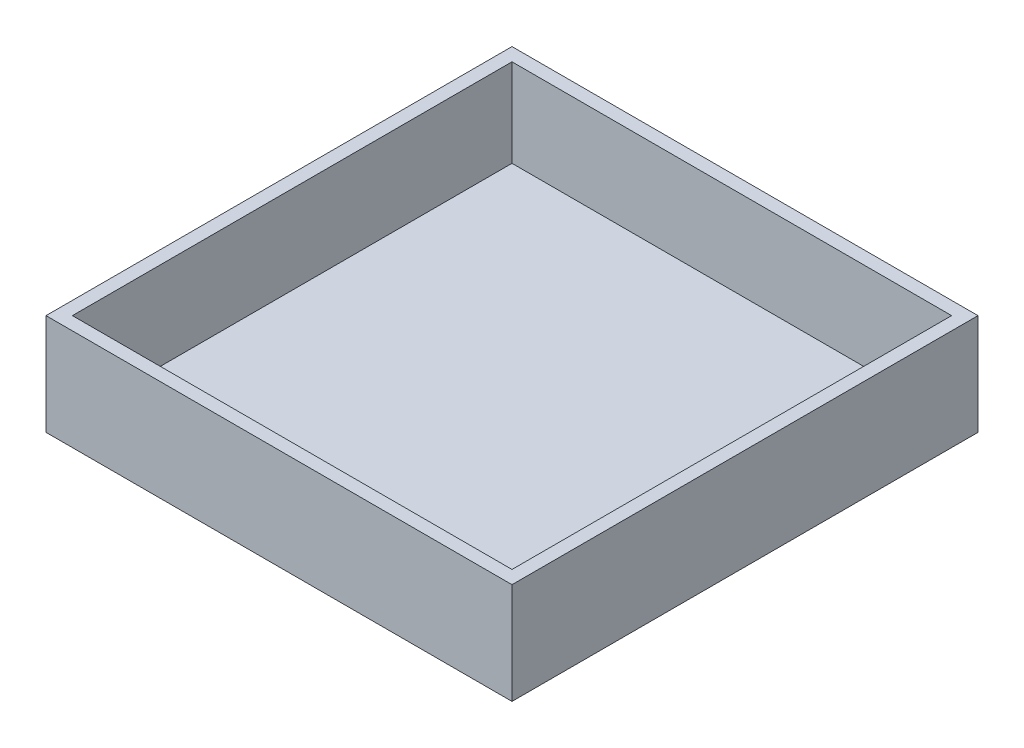
ISO-10303-21;
HEADER;
FILE_DESCRIPTION(('STEP AP214'),'2;1');
FILE_NAME('part.step','',(''),(''),'','','');
FILE_SCHEMA(('AUTOMOTIVE_DESIGN { 1 0 10303 214 1 1 1 1 }'));
ENDSEC;
DATA;
#1=APPLICATION_CONTEXT('core data for automotive mechanical design processes');
#2=APPLICATION_PROTOCOL_DEFINITION('international standard','automotive_design',2000,#1);
#3=PRODUCT_CONTEXT('',#1,'mechanical');
#4=PRODUCT('Part','Part','',(#3));
#5=PRODUCT_RELATED_PRODUCT_CATEGORY('part','',(#4));
#6=PRODUCT_DEFINITION_FORMATION('','',#4);
#7=PRODUCT_DEFINITION_CONTEXT('part definition',#1,'design');
#8=PRODUCT_DEFINITION('design','',#6,#7);
#9=PRODUCT_DEFINITION_SHAPE('','',#8);
#10=(LENGTH_UNIT() NAMED_UNIT(*) SI_UNIT(.MILLI.,.METRE.));
#11=(NAMED_UNIT(*) PLANE_ANGLE_UNIT() SI_UNIT($,.RADIAN.));
#12=(NAMED_UNIT(*) SI_UNIT($,.STERADIAN.) SOLID_ANGLE_UNIT());
#13=UNCERTAINTY_MEASURE_WITH_UNIT(LENGTH_MEASURE(1.E-05),#10,'distance_accuracy_value','');
#14=(GEOMETRIC_REPRESENTATION_CONTEXT(3) GLOBAL_UNCERTAINTY_ASSIGNED_CONTEXT((#13)) GLOBAL_UNIT_ASSIGNED_CONTEXT((#10,
#11,#12)) REPRESENTATION_CONTEXT('',''));
#15=CARTESIAN_POINT('',(0.,0.,0.));
#16=DIRECTION('',(0.,0.,1.));
#17=DIRECTION('',(1.,0.,0.));
#18=AXIS2_PLACEMENT_3D('',#15,#16,#17);
#19=CARTESIAN_POINT('',(-53.,23.,53.));
#20=DIRECTION('',(1.,0.,0.));
#21=DIRECTION('',(0.,0.,-1.));
#22=AXIS2_PLACEMENT_3D('',#19,#20,#21);
#23=PLANE('',#22);
#24=DIRECTION('',(0.,0.,1.));
#25=VECTOR('',#24,1.);
#26=CARTESIAN_POINT('',(-53.,0.,53.));
#27=LINE('',#26,#25);
#28=CARTESIAN_POINT('',(-53.,0.,-53.));
#29=VERTEX_POINT('',#28);
#30=CARTESIAN_POINT('',(-53.,0.,53.));
#31=VERTEX_POINT('',#30);
#32=EDGE_CURVE('E147',#29,#31,#27,.T.);
#33=ORIENTED_EDGE('',*,*,#32,.T.);
#34=DIRECTION('',(0.,-1.,0.));
#35=VECTOR('',#34,1.);
#36=CARTESIAN_POINT('',(-53.,23.,53.));
#37=LINE('',#36,#35);
#38=CARTESIAN_POINT('',(-53.,23.,53.));
#39=VERTEX_POINT('',#38);
#40=EDGE_CURVE('E11',#39,#31,#37,.T.);
#41=ORIENTED_EDGE('',*,*,#40,.F.);
#42=DIRECTION('',(0.,0.,1.));
#43=VECTOR('',#42,1.);
#44=CARTESIAN_POINT('',(-53.,23.,53.));
#45=LINE('',#44,#43);
#46=CARTESIAN_POINT('',(-53.,23.,-53.));
#47=VERTEX_POINT('',#46);
#48=EDGE_CURVE('E140',#47,#39,#45,.T.);
#49=ORIENTED_EDGE('',*,*,#48,.F.);
#50=DIRECTION('',(0.,-1.,0.));
#51=VECTOR('',#50,1.);
#52=CARTESIAN_POINT('',(-53.,23.,-53.));
#53=LINE('',#52,#51);
#54=EDGE_CURVE('E146',#47,#29,#53,.T.);
#55=ORIENTED_EDGE('',*,*,#54,.T.);
#56=EDGE_LOOP('',(#33,#41,#49,#55));
#57=FACE_BOUND('',#56,.T.);
#58=ADVANCED_FACE('F33',(#57),#23,.F.);
#59=CARTESIAN_POINT('',(53.,23.,53.));
#60=DIRECTION('',(0.,0.,-1.));
#61=DIRECTION('',(-1.,0.,0.));
#62=AXIS2_PLACEMENT_3D('',#59,#60,#61);
#63=PLANE('',#62);
#64=DIRECTION('',(1.,0.,0.));
#65=VECTOR('',#64,1.);
#66=CARTESIAN_POINT('',(53.,0.,53.));
#67=LINE('',#66,#65);
#68=CARTESIAN_POINT('',(53.,0.,53.));
#69=VERTEX_POINT('',#68);
#70=EDGE_CURVE('E150',#31,#69,#67,.T.);
#71=ORIENTED_EDGE('',*,*,#70,.T.);
#72=DIRECTION('',(0.,-1.,0.));
#73=VECTOR('',#72,1.);
#74=CARTESIAN_POINT('',(53.,23.,53.));
#75=LINE('',#74,#73);
#76=CARTESIAN_POINT('',(53.,23.,53.));
#77=VERTEX_POINT('',#76);
#78=EDGE_CURVE('E40',#77,#69,#75,.T.);
#79=ORIENTED_EDGE('',*,*,#78,.F.);
#80=DIRECTION('',(1.,0.,0.));
#81=VECTOR('',#80,1.);
#82=CARTESIAN_POINT('',(53.,23.,53.));
#83=LINE('',#82,#81);
#84=EDGE_CURVE('E84',#39,#77,#83,.T.);
#85=ORIENTED_EDGE('',*,*,#84,.F.);
#86=ORIENTED_EDGE('',*,*,#40,.T.);
#87=EDGE_LOOP('',(#71,#79,#85,#86));
#88=FACE_BOUND('',#87,.T.);
#89=ADVANCED_FACE('F179',(#88),#63,.F.);
#90=CARTESIAN_POINT('',(53.,23.,53.));
#91=DIRECTION('',(-1.,0.,0.));
#92=DIRECTION('',(0.,0.,1.));
#93=AXIS2_PLACEMENT_3D('',#90,#91,#92);
#94=PLANE('',#93);
#95=DIRECTION('',(0.,0.,-1.));
#96=VECTOR('',#95,1.);
#97=CARTESIAN_POINT('',(53.,0.,53.));
#98=LINE('',#97,#96);
#99=CARTESIAN_POINT('',(53.,0.,-53.));
#100=VERTEX_POINT('',#99);
#101=EDGE_CURVE('E152',#69,#100,#98,.T.);
#102=ORIENTED_EDGE('',*,*,#101,.T.);
#103=DIRECTION('',(0.,-1.,0.));
#104=VECTOR('',#103,1.);
#105=CARTESIAN_POINT('',(53.,23.,-53.));
#106=LINE('',#105,#104);
#107=CARTESIAN_POINT('',(53.,23.,-53.));
#108=VERTEX_POINT('',#107);
#109=EDGE_CURVE('E156',#108,#100,#106,.T.);
#110=ORIENTED_EDGE('',*,*,#109,.F.);
#111=DIRECTION('',(0.,0.,-1.));
#112=VECTOR('',#111,1.);
#113=CARTESIAN_POINT('',(53.,23.,53.));
#114=LINE('',#113,#112);
#115=EDGE_CURVE('E143',#77,#108,#114,.T.);
#116=ORIENTED_EDGE('',*,*,#115,.F.);
#117=ORIENTED_EDGE('',*,*,#78,.T.);
#118=EDGE_LOOP('',(#102,#110,#116,#117));
#119=FACE_BOUND('',#118,.T.);
#120=ADVANCED_FACE('F161',(#119),#94,.F.);
#121=CARTESIAN_POINT('',(53.,23.,-53.));
#122=DIRECTION('',(0.,0.,1.));
#123=DIRECTION('',(1.,0.,0.));
#124=AXIS2_PLACEMENT_3D('',#121,#122,#123);
#125=PLANE('',#124);
#126=DIRECTION('',(-1.,0.,0.));
#127=VECTOR('',#126,1.);
#128=CARTESIAN_POINT('',(53.,0.,-53.));
#129=LINE('',#128,#127);
#130=EDGE_CURVE('E77',#100,#29,#129,.T.);
#131=ORIENTED_EDGE('',*,*,#130,.T.);
#132=ORIENTED_EDGE('',*,*,#54,.F.);
#133=DIRECTION('',(-1.,0.,0.));
#134=VECTOR('',#133,1.);
#135=CARTESIAN_POINT('',(53.,23.,-53.));
#136=LINE('',#135,#134);
#137=EDGE_CURVE('E56',#108,#47,#136,.T.);
#138=ORIENTED_EDGE('',*,*,#137,.F.);
#139=ORIENTED_EDGE('',*,*,#109,.T.);
#140=EDGE_LOOP('',(#131,#132,#138,#139));
#141=FACE_BOUND('',#140,.T.);
#142=ADVANCED_FACE('F169',(#141),#125,.F.);
#143=CARTESIAN_POINT('',(0.,23.,0.));
#144=DIRECTION('',(0.,1.,0.));
#145=DIRECTION('',(0.,0.,1.));
#146=AXIS2_PLACEMENT_3D('',#143,#144,#145);
#147=PLANE('',#146);
#148=DIRECTION('',(0.,0.,1.));
#149=VECTOR('',#148,1.);
#150=CARTESIAN_POINT('',(-50.,23.,53.));
#151=LINE('',#150,#149);
#152=CARTESIAN_POINT('',(-50.,23.,-50.));
#153=VERTEX_POINT('',#152);
#154=CARTESIAN_POINT('',(-50.,23.,50.));
#155=VERTEX_POINT('',#154);
#156=EDGE_CURVE('E129',#153,#155,#151,.T.);
#157=ORIENTED_EDGE('',*,*,#156,.F.);
#158=DIRECTION('',(-1.,0.,0.));
#159=VECTOR('',#158,1.);
#160=CARTESIAN_POINT('',(53.,23.,-50.));
#161=LINE('',#160,#159);
#162=CARTESIAN_POINT('',(50.,23.,-50.));
#163=VERTEX_POINT('',#162);
#164=EDGE_CURVE('E138',#163,#153,#161,.T.);
#165=ORIENTED_EDGE('',*,*,#164,.F.);
#166=DIRECTION('',(0.,0.,-1.));
#167=VECTOR('',#166,1.);
#168=CARTESIAN_POINT('',(50.,23.,53.));
#169=LINE('',#168,#167);
#170=CARTESIAN_POINT('',(50.,23.,50.));
#171=VERTEX_POINT('',#170);
#172=EDGE_CURVE('E136',#171,#163,#169,.T.);
#173=ORIENTED_EDGE('',*,*,#172,.F.);
#174=DIRECTION('',(1.,0.,0.));
#175=VECTOR('',#174,1.);
#176=CARTESIAN_POINT('',(53.,23.,50.));
#177=LINE('',#176,#175);
#178=EDGE_CURVE('E121',#155,#171,#177,.T.);
#179=ORIENTED_EDGE('',*,*,#178,.F.);
#180=EDGE_LOOP('',(#157,#165,#173,#179));
#181=FACE_BOUND('',#180,.T.);
#182=ORIENTED_EDGE('',*,*,#48,.T.);
#183=ORIENTED_EDGE('',*,*,#84,.T.);
#184=ORIENTED_EDGE('',*,*,#115,.T.);
#185=ORIENTED_EDGE('',*,*,#137,.T.);
#186=EDGE_LOOP('',(#182,#183,#184,#185));
#187=FACE_BOUND('',#186,.T.);
#188=ADVANCED_FACE('F171',(#181,#187),#147,.T.);
#189=CARTESIAN_POINT('',(0.,0.,0.));
#190=DIRECTION('',(0.,1.,0.));
#191=DIRECTION('',(0.,0.,1.));
#192=AXIS2_PLACEMENT_3D('',#189,#190,#191);
#193=PLANE('',#192);
#194=ORIENTED_EDGE('',*,*,#32,.F.);
#195=ORIENTED_EDGE('',*,*,#130,.F.);
#196=ORIENTED_EDGE('',*,*,#101,.F.);
#197=ORIENTED_EDGE('',*,*,#70,.F.);
#198=EDGE_LOOP('',(#194,#195,#196,#197));
#199=FACE_BOUND('',#198,.T.);
#200=ADVANCED_FACE('F165',(#199),#193,.F.);
#201=CARTESIAN_POINT('',(-50.,23.,53.));
#202=DIRECTION('',(1.,0.,0.));
#203=DIRECTION('',(0.,0.,-1.));
#204=AXIS2_PLACEMENT_3D('',#201,#202,#203);
#205=PLANE('',#204);
#206=DIRECTION('',(0.,0.,1.));
#207=VECTOR('',#206,1.);
#208=CARTESIAN_POINT('',(-50.,3.,53.));
#209=LINE('',#208,#207);
#210=CARTESIAN_POINT('',(-50.,3.,-50.));
#211=VERTEX_POINT('',#210);
#212=CARTESIAN_POINT('',(-50.,3.,50.));
#213=VERTEX_POINT('',#212);
#214=EDGE_CURVE('E112',#211,#213,#209,.T.);
#215=ORIENTED_EDGE('',*,*,#214,.F.);
#216=DIRECTION('',(0.,-1.,0.));
#217=VECTOR('',#216,1.);
#218=CARTESIAN_POINT('',(-50.,23.,-50.));
#219=LINE('',#218,#217);
#220=EDGE_CURVE('E132',#153,#211,#219,.T.);
#221=ORIENTED_EDGE('',*,*,#220,.F.);
#222=ORIENTED_EDGE('',*,*,#156,.T.);
#223=DIRECTION('',(0.,-1.,0.));
#224=VECTOR('',#223,1.);
#225=CARTESIAN_POINT('',(-50.,23.,50.));
#226=LINE('',#225,#224);
#227=EDGE_CURVE('E124',#155,#213,#226,.T.);
#228=ORIENTED_EDGE('',*,*,#227,.T.);
#229=EDGE_LOOP('',(#215,#221,#222,#228));
#230=FACE_BOUND('',#229,.T.);
#231=ADVANCED_FACE('F206',(#230),#205,.T.);
#232=CARTESIAN_POINT('',(53.,23.,50.));
#233=DIRECTION('',(0.,0.,-1.));
#234=DIRECTION('',(-1.,0.,0.));
#235=AXIS2_PLACEMENT_3D('',#232,#233,#234);
#236=PLANE('',#235);
#237=DIRECTION('',(1.,0.,0.));
#238=VECTOR('',#237,1.);
#239=CARTESIAN_POINT('',(53.,3.,50.));
#240=LINE('',#239,#238);
#241=CARTESIAN_POINT('',(50.,3.,50.));
#242=VERTEX_POINT('',#241);
#243=EDGE_CURVE('E106',#213,#242,#240,.T.);
#244=ORIENTED_EDGE('',*,*,#243,.F.);
#245=ORIENTED_EDGE('',*,*,#227,.F.);
#246=ORIENTED_EDGE('',*,*,#178,.T.);
#247=DIRECTION('',(0.,-1.,0.));
#248=VECTOR('',#247,1.);
#249=CARTESIAN_POINT('',(50.,23.,50.));
#250=LINE('',#249,#248);
#251=EDGE_CURVE('E118',#171,#242,#250,.T.);
#252=ORIENTED_EDGE('',*,*,#251,.T.);
#253=EDGE_LOOP('',(#244,#245,#246,#252));
#254=FACE_BOUND('',#253,.T.);
#255=ADVANCED_FACE('F119',(#254),#236,.T.);
#256=CARTESIAN_POINT('',(50.,23.,53.));
#257=DIRECTION('',(-1.,0.,0.));
#258=DIRECTION('',(0.,0.,1.));
#259=AXIS2_PLACEMENT_3D('',#256,#257,#258);
#260=PLANE('',#259);
#261=DIRECTION('',(0.,0.,-1.));
#262=VECTOR('',#261,1.);
#263=CARTESIAN_POINT('',(50.,3.,53.));
#264=LINE('',#263,#262);
#265=CARTESIAN_POINT('',(50.,3.,-50.));
#266=VERTEX_POINT('',#265);
#267=EDGE_CURVE('E110',#242,#266,#264,.T.);
#268=ORIENTED_EDGE('',*,*,#267,.F.);
#269=ORIENTED_EDGE('',*,*,#251,.F.);
#270=ORIENTED_EDGE('',*,*,#172,.T.);
#271=DIRECTION('',(0.,-1.,0.));
#272=VECTOR('',#271,1.);
#273=CARTESIAN_POINT('',(50.,23.,-50.));
#274=LINE('',#273,#272);
#275=EDGE_CURVE('E47',#163,#266,#274,.T.);
#276=ORIENTED_EDGE('',*,*,#275,.T.);
#277=EDGE_LOOP('',(#268,#269,#270,#276));
#278=FACE_BOUND('',#277,.T.);
#279=ADVANCED_FACE('F126',(#278),#260,.T.);
#280=CARTESIAN_POINT('',(53.,23.,-50.));
#281=DIRECTION('',(0.,0.,1.));
#282=DIRECTION('',(1.,0.,0.));
#283=AXIS2_PLACEMENT_3D('',#280,#281,#282);
#284=PLANE('',#283);
#285=DIRECTION('',(-1.,0.,0.));
#286=VECTOR('',#285,1.);
#287=CARTESIAN_POINT('',(53.,3.,-50.));
#288=LINE('',#287,#286);
#289=EDGE_CURVE('E127',#266,#211,#288,.T.);
#290=ORIENTED_EDGE('',*,*,#289,.F.);
#291=ORIENTED_EDGE('',*,*,#275,.F.);
#292=ORIENTED_EDGE('',*,*,#164,.T.);
#293=ORIENTED_EDGE('',*,*,#220,.T.);
#294=EDGE_LOOP('',(#290,#291,#292,#293));
#295=FACE_BOUND('',#294,.T.);
#296=ADVANCED_FACE('F236',(#295),#284,.T.);
#297=CARTESIAN_POINT('',(0.,3.,0.));
#298=DIRECTION('',(0.,1.,0.));
#299=DIRECTION('',(0.,0.,1.));
#300=AXIS2_PLACEMENT_3D('',#297,#298,#299);
#301=PLANE('',#300);
#302=ORIENTED_EDGE('',*,*,#214,.T.);
#303=ORIENTED_EDGE('',*,*,#243,.T.);
#304=ORIENTED_EDGE('',*,*,#267,.T.);
#305=ORIENTED_EDGE('',*,*,#289,.T.);
#306=EDGE_LOOP('',(#302,#303,#304,#305));
#307=FACE_BOUND('',#306,.T.);
#308=ADVANCED_FACE('F108',(#307),#301,.T.);
#309=CLOSED_SHELL('',(#58,#89,#120,#142,#188,#200,#231,#255,#279,#296,#308));
#310=MANIFOLD_SOLID_BREP('B2',#309);
#311=ADVANCED_BREP_SHAPE_REPRESENTATION('',(#18,#310),#14);
#312=SHAPE_DEFINITION_REPRESENTATION(#9,#311);
ENDSEC;
END-ISO-10303-21;
